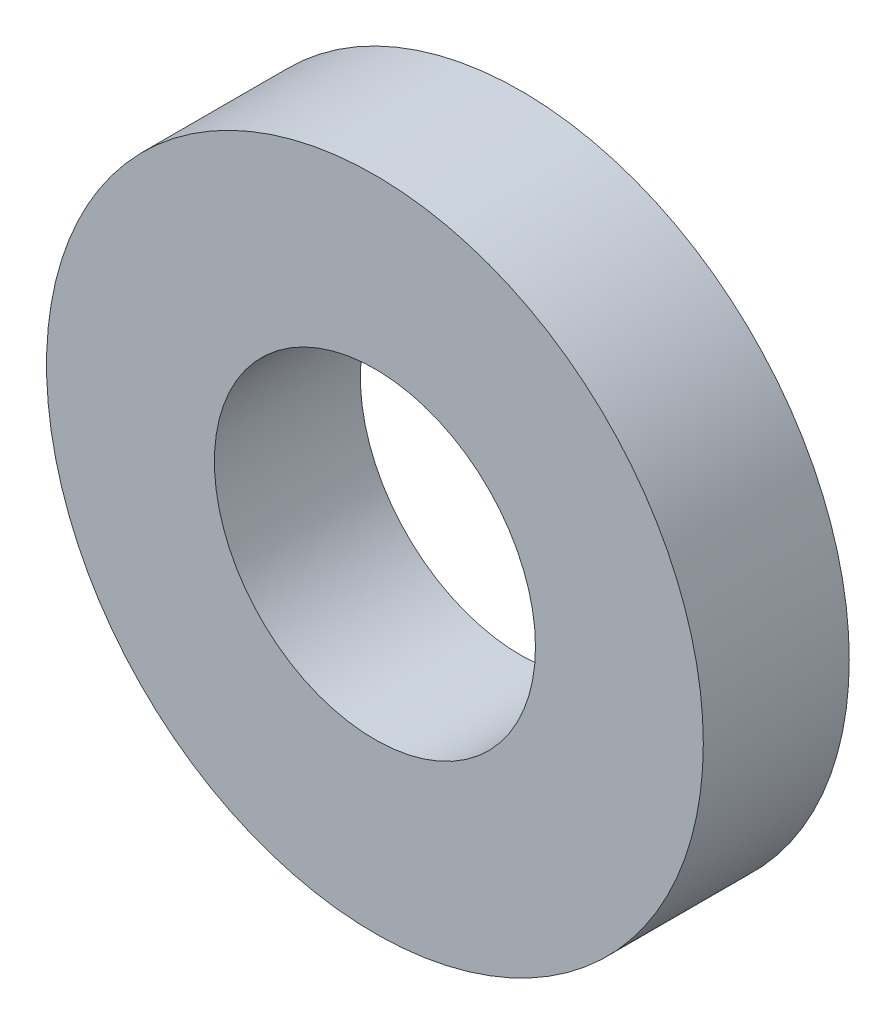
ISO-10303-21;
HEADER;
FILE_DESCRIPTION(('STEP AP214'),'2;1');
FILE_NAME('part.step','',(''),(''),'','','');
FILE_SCHEMA(('AUTOMOTIVE_DESIGN { 1 0 10303 214 1 1 1 1 }'));
ENDSEC;
DATA;
#1=APPLICATION_CONTEXT('core data for automotive mechanical design processes');
#2=APPLICATION_PROTOCOL_DEFINITION('international standard','automotive_design',2000,#1);
#3=PRODUCT_CONTEXT('',#1,'mechanical');
#4=PRODUCT('Part','Part','',(#3));
#5=PRODUCT_RELATED_PRODUCT_CATEGORY('part','',(#4));
#6=PRODUCT_DEFINITION_FORMATION('','',#4);
#7=PRODUCT_DEFINITION_CONTEXT('part definition',#1,'design');
#8=PRODUCT_DEFINITION('design','',#6,#7);
#9=PRODUCT_DEFINITION_SHAPE('','',#8);
#10=(LENGTH_UNIT() NAMED_UNIT(*) SI_UNIT(.MILLI.,.METRE.));
#11=(NAMED_UNIT(*) PLANE_ANGLE_UNIT() SI_UNIT($,.RADIAN.));
#12=(NAMED_UNIT(*) SI_UNIT($,.STERADIAN.) SOLID_ANGLE_UNIT());
#13=UNCERTAINTY_MEASURE_WITH_UNIT(LENGTH_MEASURE(1.E-05),#10,'distance_accuracy_value','');
#14=(GEOMETRIC_REPRESENTATION_CONTEXT(3) GLOBAL_UNCERTAINTY_ASSIGNED_CONTEXT((#13)) GLOBAL_UNIT_ASSIGNED_CONTEXT((#10,
#11,#12)) REPRESENTATION_CONTEXT('',''));
#15=CARTESIAN_POINT('',(0.,0.,0.));
#16=DIRECTION('',(0.,0.,1.));
#17=DIRECTION('',(1.,0.,0.));
#18=AXIS2_PLACEMENT_3D('',#15,#16,#17);
#19=CARTESIAN_POINT('',(0.,0.,-0.5));
#20=DIRECTION('',(0.,0.,1.));
#21=DIRECTION('',(1.,0.,0.));
#22=AXIS2_PLACEMENT_3D('',#19,#20,#21);
#23=CYLINDRICAL_SURFACE('',#22,2.2);
#24=CARTESIAN_POINT('',(0.,0.,2.));
#25=DIRECTION('',(0.,0.,1.));
#26=DIRECTION('',(1.,0.,0.));
#27=AXIS2_PLACEMENT_3D('',#24,#25,#26);
#28=CIRCLE('',#27,2.2);
#29=CARTESIAN_POINT('',(2.2,0.,2.));
#30=VERTEX_POINT('',#29);
#31=EDGE_CURVE('E22',#30,#30,#28,.T.);
#32=ORIENTED_EDGE('',*,*,#31,.T.);
#33=EDGE_LOOP('',(#32));
#34=FACE_BOUND('',#33,.T.);
#35=CARTESIAN_POINT('',(0.,0.,0.));
#36=DIRECTION('',(0.,0.,1.));
#37=DIRECTION('',(1.,0.,0.));
#38=AXIS2_PLACEMENT_3D('',#35,#36,#37);
#39=CIRCLE('',#38,2.2);
#40=CARTESIAN_POINT('',(2.2,0.,0.));
#41=VERTEX_POINT('',#40);
#42=EDGE_CURVE('E10',#41,#41,#39,.T.);
#43=ORIENTED_EDGE('',*,*,#42,.F.);
#44=EDGE_LOOP('',(#43));
#45=FACE_BOUND('',#44,.T.);
#46=ADVANCED_FACE('F15',(#34,#45),#23,.F.);
#47=CARTESIAN_POINT('',(0.,0.,0.));
#48=DIRECTION('',(0.,0.,1.));
#49=DIRECTION('',(1.,0.,0.));
#50=AXIS2_PLACEMENT_3D('',#47,#48,#49);
#51=PLANE('',#50);
#52=ORIENTED_EDGE('',*,*,#42,.T.);
#53=EDGE_LOOP('',(#52));
#54=FACE_BOUND('',#53,.T.);
#55=CARTESIAN_POINT('',(0.,0.,0.));
#56=DIRECTION('',(0.,0.,1.));
#57=DIRECTION('',(1.,0.,0.));
#58=AXIS2_PLACEMENT_3D('',#55,#56,#57);
#59=CIRCLE('',#58,4.5);
#60=CARTESIAN_POINT('',(4.5,0.,0.));
#61=VERTEX_POINT('',#60);
#62=EDGE_CURVE('E31',#61,#61,#59,.T.);
#63=ORIENTED_EDGE('',*,*,#62,.F.);
#64=EDGE_LOOP('',(#63));
#65=FACE_BOUND('',#64,.T.);
#66=ADVANCED_FACE('F55',(#54,#65),#51,.F.);
#67=CARTESIAN_POINT('',(0.,0.,2.));
#68=DIRECTION('',(0.,0.,1.));
#69=DIRECTION('',(1.,0.,0.));
#70=AXIS2_PLACEMENT_3D('',#67,#68,#69);
#71=PLANE('',#70);
#72=ORIENTED_EDGE('',*,*,#31,.F.);
#73=EDGE_LOOP('',(#72));
#74=FACE_BOUND('',#73,.T.);
#75=CARTESIAN_POINT('',(0.,0.,2.));
#76=DIRECTION('',(0.,0.,1.));
#77=DIRECTION('',(1.,0.,0.));
#78=AXIS2_PLACEMENT_3D('',#75,#76,#77);
#79=CIRCLE('',#78,4.5);
#80=CARTESIAN_POINT('',(4.5,0.,2.));
#81=VERTEX_POINT('',#80);
#82=EDGE_CURVE('E38',#81,#81,#79,.T.);
#83=ORIENTED_EDGE('',*,*,#82,.T.);
#84=EDGE_LOOP('',(#83));
#85=FACE_BOUND('',#84,.T.);
#86=ADVANCED_FACE('F47',(#74,#85),#71,.T.);
#87=CARTESIAN_POINT('',(0.,0.,0.));
#88=DIRECTION('',(0.,0.,1.));
#89=DIRECTION('',(1.,0.,0.));
#90=AXIS2_PLACEMENT_3D('',#87,#88,#89);
#91=CYLINDRICAL_SURFACE('',#90,4.5);
#92=ORIENTED_EDGE('',*,*,#82,.F.);
#93=EDGE_LOOP('',(#92));
#94=FACE_BOUND('',#93,.T.);
#95=ORIENTED_EDGE('',*,*,#62,.T.);
#96=EDGE_LOOP('',(#95));
#97=FACE_BOUND('',#96,.T.);
#98=ADVANCED_FACE('F49',(#94,#97),#91,.T.);
#99=CLOSED_SHELL('',(#46,#66,#86,#98));
#100=MANIFOLD_SOLID_BREP('B1',#99);
#101=ADVANCED_BREP_SHAPE_REPRESENTATION('',(#18,#100),#14);
#102=SHAPE_DEFINITION_REPRESENTATION(#9,#101);
ENDSEC;
END-ISO-10303-21;
